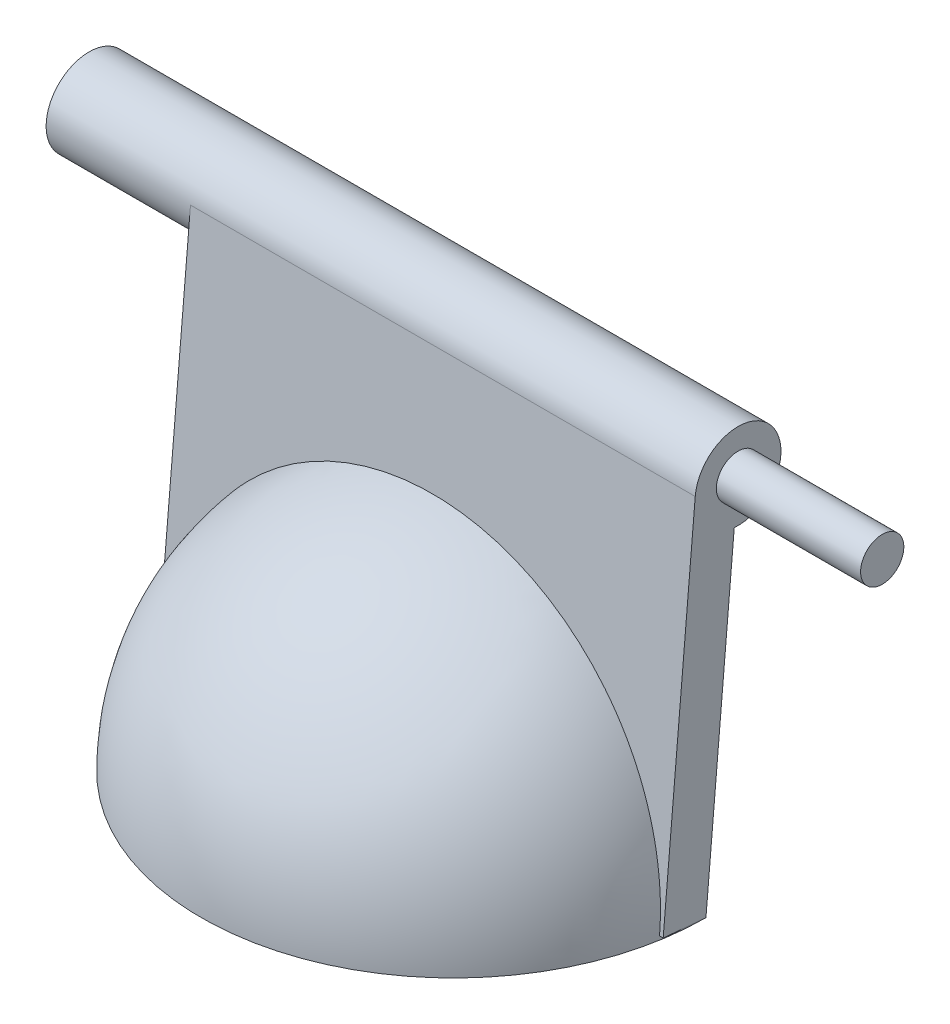
ISO-10303-21;
HEADER;
FILE_DESCRIPTION(('STEP AP214'),'2;1');
FILE_NAME('part.step','',(''),(''),'','','');
FILE_SCHEMA(('AUTOMOTIVE_DESIGN { 1 0 10303 214 1 1 1 1 }'));
ENDSEC;
DATA;
#1=APPLICATION_CONTEXT('core data for automotive mechanical design processes');
#2=APPLICATION_PROTOCOL_DEFINITION('international standard','automotive_design',2000,#1);
#3=PRODUCT_CONTEXT('',#1,'mechanical');
#4=PRODUCT('Part','Part','',(#3));
#5=PRODUCT_RELATED_PRODUCT_CATEGORY('part','',(#4));
#6=PRODUCT_DEFINITION_FORMATION('','',#4);
#7=PRODUCT_DEFINITION_CONTEXT('part definition',#1,'design');
#8=PRODUCT_DEFINITION('design','',#6,#7);
#9=PRODUCT_DEFINITION_SHAPE('','',#8);
#10=(LENGTH_UNIT() NAMED_UNIT(*) SI_UNIT(.MILLI.,.METRE.));
#11=(NAMED_UNIT(*) PLANE_ANGLE_UNIT() SI_UNIT($,.RADIAN.));
#12=(NAMED_UNIT(*) SI_UNIT($,.STERADIAN.) SOLID_ANGLE_UNIT());
#13=UNCERTAINTY_MEASURE_WITH_UNIT(LENGTH_MEASURE(1.E-05),#10,'distance_accuracy_value','');
#14=(GEOMETRIC_REPRESENTATION_CONTEXT(3) GLOBAL_UNCERTAINTY_ASSIGNED_CONTEXT((#13)) GLOBAL_UNIT_ASSIGNED_CONTEXT((#10,
#11,#12)) REPRESENTATION_CONTEXT('',''));
#15=CARTESIAN_POINT('',(0.,0.,0.));
#16=DIRECTION('',(0.,0.,1.));
#17=DIRECTION('',(1.,0.,0.));
#18=AXIS2_PLACEMENT_3D('',#15,#16,#17);
#19=CARTESIAN_POINT('',(45.,-25.4072411203425,2.22284556949957));
#20=DIRECTION('',(0.,0.996194698091746,-0.0871557427476543));
#21=DIRECTION('',(0.,0.0871557427476543,0.996194698091746));
#22=AXIS2_PLACEMENT_3D('',#19,#20,#21);
#23=PLANE('',#22);
#24=CARTESIAN_POINT('',(27.5,-25.4072411203425,2.22284556949956));
#25=DIRECTION('',(0.,0.996194698091746,-0.0871557427476543));
#26=DIRECTION('',(0.,0.0871557427476543,0.996194698091746));
#27=AXIS2_PLACEMENT_3D('',#24,#25,#26);
#28=CIRCLE('',#27,17.5);
#29=CARTESIAN_POINT('',(10.2551603733175,-25.1477348963113,5.18901528306774));
#30=VERTEX_POINT('',#29);
#31=CARTESIAN_POINT('',(10.,-25.4072411203425,2.22284556949957));
#32=VERTEX_POINT('',#31);
#33=EDGE_CURVE('E217',#30,#32,#28,.F.);
#34=ORIENTED_EDGE('',*,*,#33,.F.);
#35=DIRECTION('',(-1.,0.,0.));
#36=VECTOR('',#35,1.);
#37=CARTESIAN_POINT('',(45.,-25.1477348963113,5.18901528306774));
#38=LINE('',#37,#36);
#39=CARTESIAN_POINT('',(10.,-25.1477348963113,5.18901528306774));
#40=VERTEX_POINT('',#39);
#41=EDGE_CURVE('E185',#30,#40,#38,.T.);
#42=ORIENTED_EDGE('',*,*,#41,.T.);
#43=DIRECTION('',(0.,-0.0871557427476543,-0.996194698091746));
#44=VECTOR('',#43,1.);
#45=CARTESIAN_POINT('',(10.,-25.4072411203425,2.22284556949957));
#46=LINE('',#45,#44);
#47=EDGE_CURVE('E175',#40,#32,#46,.T.);
#48=ORIENTED_EDGE('',*,*,#47,.T.);
#49=EDGE_LOOP('',(#34,#42,#48));
#50=FACE_BOUND('',#49,.T.);
#51=ADVANCED_FACE('F47',(#50),#23,.F.);
#52=CARTESIAN_POINT('',(45.,-25.4072411203425,2.22284556949957));
#53=VERTEX_POINT('',#52);
#54=CARTESIAN_POINT('',(44.7448396266825,-25.1477348963113,5.18901528306774));
#55=VERTEX_POINT('',#54);
#56=EDGE_CURVE('E215',#53,#55,#28,.F.);
#57=ORIENTED_EDGE('',*,*,#56,.F.);
#58=DIRECTION('',(0.,-0.0871557427476543,-0.996194698091746));
#59=VECTOR('',#58,1.);
#60=CARTESIAN_POINT('',(45.,-25.4072411203425,2.22284556949957));
#61=LINE('',#60,#59);
#62=CARTESIAN_POINT('',(45.,-25.1477348963113,5.18901528306774));
#63=VERTEX_POINT('',#62);
#64=EDGE_CURVE('E163',#63,#53,#61,.T.);
#65=ORIENTED_EDGE('',*,*,#64,.F.);
#66=EDGE_CURVE('E186',#63,#55,#38,.T.);
#67=ORIENTED_EDGE('',*,*,#66,.T.);
#68=EDGE_LOOP('',(#57,#65,#67));
#69=FACE_BOUND('',#68,.T.);
#70=ADVANCED_FACE('F247',(#69),#23,.F.);
#71=CARTESIAN_POINT('',(55.,0.,0.));
#72=DIRECTION('',(-1.,0.,0.));
#73=DIRECTION('',(0.,0.,1.));
#74=AXIS2_PLACEMENT_3D('',#71,#72,#73);
#75=CYLINDRICAL_SURFACE('',#74,2.9775);
#76=CARTESIAN_POINT('',(0.,0.,0.));
#77=DIRECTION('',(1.,0.,0.));
#78=DIRECTION('',(0.,0.,-1.));
#79=AXIS2_PLACEMENT_3D('',#76,#77,#78);
#80=CIRCLE('',#79,2.9775);
#81=CARTESIAN_POINT('',(0.,0.,-2.9775));
#82=VERTEX_POINT('',#81);
#83=EDGE_CURVE('E207',#82,#82,#80,.T.);
#84=ORIENTED_EDGE('',*,*,#83,.T.);
#85=EDGE_LOOP('',(#84));
#86=FACE_BOUND('',#85,.T.);
#87=DIRECTION('',(-1.,0.,0.));
#88=VECTOR('',#87,1.);
#89=CARTESIAN_POINT('',(45.,0.25950622403113,2.96616971356818));
#90=LINE('',#89,#88);
#91=CARTESIAN_POINT('',(45.,0.25950622403113,2.96616971356818));
#92=VERTEX_POINT('',#91);
#93=CARTESIAN_POINT('',(10.,0.259506224031141,2.96616971356817));
#94=VERTEX_POINT('',#93);
#95=EDGE_CURVE('E71',#92,#94,#90,.T.);
#96=ORIENTED_EDGE('',*,*,#95,.F.);
#97=CARTESIAN_POINT('',(45.,0.,0.));
#98=DIRECTION('',(1.,0.,0.));
#99=DIRECTION('',(0.,0.,-1.));
#100=AXIS2_PLACEMENT_3D('',#97,#98,#99);
#101=CIRCLE('',#100,2.9775);
#102=CARTESIAN_POINT('',(45.,-2.96616971356817,0.259506224031141));
#103=VERTEX_POINT('',#102);
#104=EDGE_CURVE('E200',#103,#92,#101,.T.);
#105=ORIENTED_EDGE('',*,*,#104,.F.);
#106=DIRECTION('',(-1.,0.,0.));
#107=VECTOR('',#106,1.);
#108=CARTESIAN_POINT('',(55.,-2.96616971356817,0.259506224031141));
#109=LINE('',#108,#107);
#110=CARTESIAN_POINT('',(10.,-2.96616971356817,0.259506224031141));
#111=VERTEX_POINT('',#110);
#112=EDGE_CURVE('E192',#111,#103,#109,.F.);
#113=ORIENTED_EDGE('',*,*,#112,.F.);
#114=CARTESIAN_POINT('',(10.,0.,0.));
#115=DIRECTION('',(-1.,0.,0.));
#116=DIRECTION('',(0.,0.,1.));
#117=AXIS2_PLACEMENT_3D('',#114,#115,#116);
#118=CIRCLE('',#117,2.9775);
#119=EDGE_CURVE('E211',#111,#94,#118,.T.);
#120=ORIENTED_EDGE('',*,*,#119,.T.);
#121=EDGE_LOOP('',(#96,#105,#113,#120));
#122=FACE_BOUND('',#121,.T.);
#123=ADVANCED_FACE('F49',(#86,#122),#75,.T.);
#124=CARTESIAN_POINT('',(0.,0.,0.));
#125=DIRECTION('',(1.,0.,0.));
#126=DIRECTION('',(0.,0.,-1.));
#127=AXIS2_PLACEMENT_3D('',#124,#125,#126);
#128=PLANE('',#127);
#129=ORIENTED_EDGE('',*,*,#83,.F.);
#130=EDGE_LOOP('',(#129));
#131=FACE_BOUND('',#130,.T.);
#132=ADVANCED_FACE('F359',(#131),#128,.F.);
#133=CARTESIAN_POINT('',(45.,0.,0.));
#134=DIRECTION('',(1.,0.,0.));
#135=DIRECTION('',(0.,0.,-1.));
#136=AXIS2_PLACEMENT_3D('',#133,#134,#135);
#137=PLANE('',#136);
#138=CARTESIAN_POINT('',(45.,0.,0.));
#139=DIRECTION('',(1.,0.,0.));
#140=DIRECTION('',(0.,0.,-1.));
#141=AXIS2_PLACEMENT_3D('',#138,#139,#140);
#142=CIRCLE('',#141,1.5);
#143=CARTESIAN_POINT('',(45.,0.,-1.5));
#144=VERTEX_POINT('',#143);
#145=EDGE_CURVE('E196',#144,#144,#142,.T.);
#146=ORIENTED_EDGE('',*,*,#145,.F.);
#147=EDGE_LOOP('',(#146));
#148=FACE_BOUND('',#147,.T.);
#149=ORIENTED_EDGE('',*,*,#104,.T.);
#150=DIRECTION('',(0.,-0.996194698091746,0.0871557427476543));
#151=VECTOR('',#150,1.);
#152=CARTESIAN_POINT('',(45.,-25.1477348963113,5.18901528306774));
#153=LINE('',#152,#151);
#154=EDGE_CURVE('E160',#92,#63,#153,.T.);
#155=ORIENTED_EDGE('',*,*,#154,.T.);
#156=ORIENTED_EDGE('',*,*,#64,.T.);
#157=DIRECTION('',(0.,0.996194698091746,-0.0871557427476545));
#158=VECTOR('',#157,1.);
#159=CARTESIAN_POINT('',(45.,0.,0.));
#160=LINE('',#159,#158);
#161=EDGE_CURVE('E168',#53,#103,#160,.T.);
#162=ORIENTED_EDGE('',*,*,#161,.T.);
#163=EDGE_LOOP('',(#149,#155,#156,#162));
#164=FACE_BOUND('',#163,.T.);
#165=ADVANCED_FACE('F243',(#148,#164),#137,.T.);
#166=CARTESIAN_POINT('',(45.,0.,0.));
#167=DIRECTION('',(1.,0.,0.));
#168=DIRECTION('',(0.,0.,-1.));
#169=AXIS2_PLACEMENT_3D('',#166,#167,#168);
#170=CYLINDRICAL_SURFACE('',#169,1.5);
#171=ORIENTED_EDGE('',*,*,#145,.T.);
#172=EDGE_LOOP('',(#171));
#173=FACE_BOUND('',#172,.T.);
#174=CARTESIAN_POINT('',(55.,0.,0.));
#175=DIRECTION('',(1.,0.,0.));
#176=DIRECTION('',(0.,0.,-1.));
#177=AXIS2_PLACEMENT_3D('',#174,#175,#176);
#178=CIRCLE('',#177,1.5);
#179=CARTESIAN_POINT('',(55.,0.,-1.5));
#180=VERTEX_POINT('',#179);
#181=EDGE_CURVE('E195',#180,#180,#178,.T.);
#182=ORIENTED_EDGE('',*,*,#181,.F.);
#183=EDGE_LOOP('',(#182));
#184=FACE_BOUND('',#183,.T.);
#185=ADVANCED_FACE('F358',(#173,#184),#170,.T.);
#186=CARTESIAN_POINT('',(55.,0.,0.));
#187=DIRECTION('',(1.,0.,0.));
#188=DIRECTION('',(0.,0.,-1.));
#189=AXIS2_PLACEMENT_3D('',#186,#187,#188);
#190=PLANE('',#189);
#191=ORIENTED_EDGE('',*,*,#181,.T.);
#192=EDGE_LOOP('',(#191));
#193=FACE_BOUND('',#192,.T.);
#194=ADVANCED_FACE('F259',(#193),#190,.T.);
#195=CARTESIAN_POINT('',(45.,0.,0.));
#196=DIRECTION('',(0.,0.0871557427476545,0.996194698091746));
#197=DIRECTION('',(0.,-0.996194698091746,0.0871557427476545));
#198=AXIS2_PLACEMENT_3D('',#195,#196,#197);
#199=PLANE('',#198);
#200=DIRECTION('',(-1.,0.,0.));
#201=VECTOR('',#200,1.);
#202=CARTESIAN_POINT('',(45.,-25.4072411203425,2.22284556949957));
#203=LINE('',#202,#201);
#204=CARTESIAN_POINT('',(42.5,-25.4072411203425,2.22284556949957));
#205=VERTEX_POINT('',#204);
#206=EDGE_CURVE('E172',#53,#205,#203,.T.);
#207=ORIENTED_EDGE('',*,*,#206,.T.);
#208=CARTESIAN_POINT('',(27.5,-25.4072411203425,2.22284556949957));
#209=DIRECTION('',(0.,-0.0871557427476545,-0.996194698091746));
#210=DIRECTION('',(0.,0.996194698091746,-0.0871557427476545));
#211=AXIS2_PLACEMENT_3D('',#208,#209,#210);
#212=CIRCLE('',#211,15.);
#213=CARTESIAN_POINT('',(12.5,-25.4072411203425,2.22284556949957));
#214=VERTEX_POINT('',#213);
#215=EDGE_CURVE('E121',#214,#205,#212,.T.);
#216=ORIENTED_EDGE('',*,*,#215,.F.);
#217=DIRECTION('',(1.,0.,0.));
#218=VECTOR('',#217,1.);
#219=CARTESIAN_POINT('',(0.,-25.4072411203425,2.22284556949957));
#220=LINE('',#219,#218);
#221=EDGE_CURVE('E152',#32,#214,#220,.T.);
#222=ORIENTED_EDGE('',*,*,#221,.F.);
#223=DIRECTION('',(0.,0.996194698091746,-0.0871557427476545));
#224=VECTOR('',#223,1.);
#225=CARTESIAN_POINT('',(10.,0.,0.));
#226=LINE('',#225,#224);
#227=EDGE_CURVE('E164',#32,#111,#226,.T.);
#228=ORIENTED_EDGE('',*,*,#227,.T.);
#229=ORIENTED_EDGE('',*,*,#112,.T.);
#230=ORIENTED_EDGE('',*,*,#161,.F.);
#231=EDGE_LOOP('',(#207,#216,#222,#228,#229,#230));
#232=FACE_BOUND('',#231,.T.);
#233=ADVANCED_FACE('F233',(#232),#199,.F.);
#234=CARTESIAN_POINT('',(45.,-25.1477348963113,5.18901528306774));
#235=DIRECTION('',(0.,-0.0871557427476543,-0.996194698091746));
#236=DIRECTION('',(0.,0.996194698091746,-0.0871557427476543));
#237=AXIS2_PLACEMENT_3D('',#234,#235,#236);
#238=PLANE('',#237);
#239=CARTESIAN_POINT('',(27.5,-25.1477348963113,5.18901528306774));
#240=DIRECTION('',(0.,-0.0871557427476543,-0.996194698091746));
#241=DIRECTION('',(0.,0.996194698091746,-0.0871557427476543));
#242=AXIS2_PLACEMENT_3D('',#239,#240,#241);
#243=CIRCLE('',#242,17.2448396266825);
#244=EDGE_CURVE('E156',#55,#30,#243,.F.);
#245=ORIENTED_EDGE('',*,*,#244,.F.);
#246=ORIENTED_EDGE('',*,*,#66,.F.);
#247=ORIENTED_EDGE('',*,*,#154,.F.);
#248=ORIENTED_EDGE('',*,*,#95,.T.);
#249=DIRECTION('',(0.,-0.996194698091746,0.0871557427476543));
#250=VECTOR('',#249,1.);
#251=CARTESIAN_POINT('',(10.,-25.1477348963113,5.18901528306774));
#252=LINE('',#251,#250);
#253=EDGE_CURVE('E159',#94,#40,#252,.T.);
#254=ORIENTED_EDGE('',*,*,#253,.T.);
#255=ORIENTED_EDGE('',*,*,#41,.F.);
#256=EDGE_LOOP('',(#245,#246,#247,#248,#254,#255));
#257=FACE_BOUND('',#256,.T.);
#258=ADVANCED_FACE('F248',(#257),#238,.F.);
#259=CARTESIAN_POINT('',(10.,0.,0.));
#260=DIRECTION('',(-1.,0.,0.));
#261=DIRECTION('',(0.,0.,1.));
#262=AXIS2_PLACEMENT_3D('',#259,#260,#261);
#263=PLANE('',#262);
#264=ORIENTED_EDGE('',*,*,#119,.F.);
#265=ORIENTED_EDGE('',*,*,#227,.F.);
#266=ORIENTED_EDGE('',*,*,#47,.F.);
#267=ORIENTED_EDGE('',*,*,#253,.F.);
#268=EDGE_LOOP('',(#264,#265,#266,#267));
#269=FACE_BOUND('',#268,.T.);
#270=ADVANCED_FACE('F238',(#269),#263,.T.);
#271=CARTESIAN_POINT('',(27.5,-25.4072411203425,2.22284556949956));
#272=DIRECTION('',(-1.,0.,0.));
#273=DIRECTION('',(0.,0.,1.));
#274=AXIS2_PLACEMENT_3D('',#271,#272,#273);
#275=SPHERICAL_SURFACE('',#274,15.);
#276=CARTESIAN_POINT('',(27.5,-25.1457738920995,5.21142966377479));
#277=DIRECTION('',(0.,-0.0871557427476545,-0.996194698091746));
#278=DIRECTION('',(0.,0.996194698091746,-0.0871557427476545));
#279=AXIS2_PLACEMENT_3D('',#276,#277,#278);
#280=CIRCLE('',#279,14.6969384566991);
#281=CARTESIAN_POINT('',(12.8030615433009,-25.1457738920995,5.21142966377479));
#282=VERTEX_POINT('',#281);
#283=CARTESIAN_POINT('',(42.1969384566991,-25.1457738920995,5.21142966377479));
#284=VERTEX_POINT('',#283);
#285=EDGE_CURVE('E11',#282,#284,#280,.T.);
#286=ORIENTED_EDGE('',*,*,#285,.T.);
#287=CARTESIAN_POINT('',(27.5,-25.4072411203425,2.22284556949956));
#288=DIRECTION('',(0.,0.996194698091746,-0.0871557427476543));
#289=DIRECTION('',(0.,0.0871557427476543,0.996194698091746));
#290=AXIS2_PLACEMENT_3D('',#287,#288,#289);
#291=CIRCLE('',#290,15.);
#292=EDGE_CURVE('E63',#205,#284,#291,.F.);
#293=ORIENTED_EDGE('',*,*,#292,.F.);
#294=CARTESIAN_POINT('',(27.5,-25.4072411203425,2.22284556949956));
#295=DIRECTION('',(0.,-1.,0.));
#296=DIRECTION('',(0.,0.,-1.));
#297=AXIS2_PLACEMENT_3D('',#294,#295,#296);
#298=CIRCLE('',#297,15.);
#299=EDGE_CURVE('E143',#205,#214,#298,.T.);
#300=ORIENTED_EDGE('',*,*,#299,.T.);
#301=EDGE_CURVE('E56',#282,#214,#291,.F.);
#302=ORIENTED_EDGE('',*,*,#301,.F.);
#303=EDGE_LOOP('',(#286,#293,#300,#302));
#304=FACE_BOUND('',#303,.T.);
#305=ADVANCED_FACE('F256',(#304),#275,.F.);
#306=CARTESIAN_POINT('',(27.5,-25.4072411203425,2.22284556949956));
#307=DIRECTION('',(-1.,0.,0.));
#308=DIRECTION('',(0.,0.,1.));
#309=AXIS2_PLACEMENT_3D('',#306,#307,#308);
#310=SPHERICAL_SURFACE('',#309,17.5);
#311=ORIENTED_EDGE('',*,*,#244,.T.);
#312=ORIENTED_EDGE('',*,*,#33,.T.);
#313=CARTESIAN_POINT('',(27.5,-25.4072411203425,2.22284556949956));
#314=DIRECTION('',(0.,-1.,0.));
#315=DIRECTION('',(0.,0.,-1.));
#316=AXIS2_PLACEMENT_3D('',#313,#314,#315);
#317=CIRCLE('',#316,17.5);
#318=EDGE_CURVE('E148',#53,#32,#317,.T.);
#319=ORIENTED_EDGE('',*,*,#318,.F.);
#320=ORIENTED_EDGE('',*,*,#56,.T.);
#321=EDGE_LOOP('',(#311,#312,#319,#320));
#322=FACE_BOUND('',#321,.T.);
#323=ADVANCED_FACE('F224',(#322),#310,.T.);
#324=CARTESIAN_POINT('',(0.,-25.4072411203425,2.22284556949957));
#325=DIRECTION('',(0.,-1.,0.));
#326=DIRECTION('',(0.,0.,-1.));
#327=AXIS2_PLACEMENT_3D('',#324,#325,#326);
#328=PLANE('',#327);
#329=ORIENTED_EDGE('',*,*,#299,.F.);
#330=ORIENTED_EDGE('',*,*,#206,.F.);
#331=ORIENTED_EDGE('',*,*,#318,.T.);
#332=ORIENTED_EDGE('',*,*,#221,.T.);
#333=EDGE_LOOP('',(#329,#330,#331,#332));
#334=FACE_BOUND('',#333,.T.);
#335=ADVANCED_FACE('F231',(#334),#328,.T.);
#336=CARTESIAN_POINT('',(12.5,-25.1457738920995,5.21142966377479));
#337=DIRECTION('',(0.,-0.996194698091746,0.0871557427476545));
#338=DIRECTION('',(0.,-0.0871557427476545,-0.996194698091746));
#339=AXIS2_PLACEMENT_3D('',#336,#337,#338);
#340=PLANE('',#339);
#341=ORIENTED_EDGE('',*,*,#292,.T.);
#342=DIRECTION('',(-1.,0.,0.));
#343=VECTOR('',#342,1.);
#344=CARTESIAN_POINT('',(12.5,-25.1457738920995,5.21142966377479));
#345=LINE('',#344,#343);
#346=CARTESIAN_POINT('',(42.5,-25.1457738920995,5.21142966377479));
#347=VERTEX_POINT('',#346);
#348=EDGE_CURVE('E125',#347,#284,#345,.T.);
#349=ORIENTED_EDGE('',*,*,#348,.F.);
#350=DIRECTION('',(0.,-0.0871557427476545,-0.996194698091746));
#351=VECTOR('',#350,1.);
#352=CARTESIAN_POINT('',(42.5,-25.1457738920995,5.21142966377479));
#353=LINE('',#352,#351);
#354=EDGE_CURVE('E115',#347,#205,#353,.T.);
#355=ORIENTED_EDGE('',*,*,#354,.T.);
#356=EDGE_LOOP('',(#341,#349,#355));
#357=FACE_BOUND('',#356,.T.);
#358=ADVANCED_FACE('F135',(#357),#340,.F.);
#359=CARTESIAN_POINT('',(27.5,-25.1457738920995,5.21142966377479));
#360=DIRECTION('',(0.,-0.0871557427476545,-0.996194698091746));
#361=DIRECTION('',(0.,0.996194698091746,-0.0871557427476545));
#362=AXIS2_PLACEMENT_3D('',#359,#360,#361);
#363=CYLINDRICAL_SURFACE('',#362,15.);
#364=ORIENTED_EDGE('',*,*,#215,.T.);
#365=ORIENTED_EDGE('',*,*,#354,.F.);
#366=CARTESIAN_POINT('',(27.5,-25.1457738920995,5.21142966377479));
#367=DIRECTION('',(0.,-0.0871557427476545,-0.996194698091746));
#368=DIRECTION('',(0.,0.996194698091746,-0.0871557427476545));
#369=AXIS2_PLACEMENT_3D('',#366,#367,#368);
#370=CIRCLE('',#369,15.);
#371=CARTESIAN_POINT('',(12.5,-25.1457738920995,5.21142966377479));
#372=VERTEX_POINT('',#371);
#373=EDGE_CURVE('E119',#372,#347,#370,.T.);
#374=ORIENTED_EDGE('',*,*,#373,.F.);
#375=DIRECTION('',(0.,-0.0871557427476545,-0.996194698091746));
#376=VECTOR('',#375,1.);
#377=CARTESIAN_POINT('',(12.5,-25.1457738920995,5.21142966377479));
#378=LINE('',#377,#376);
#379=EDGE_CURVE('E124',#372,#214,#378,.T.);
#380=ORIENTED_EDGE('',*,*,#379,.T.);
#381=EDGE_LOOP('',(#364,#365,#374,#380));
#382=FACE_BOUND('',#381,.T.);
#383=ADVANCED_FACE('F117',(#382),#363,.F.);
#384=EDGE_CURVE('E131',#282,#372,#345,.T.);
#385=ORIENTED_EDGE('',*,*,#384,.F.);
#386=ORIENTED_EDGE('',*,*,#301,.T.);
#387=ORIENTED_EDGE('',*,*,#379,.F.);
#388=EDGE_LOOP('',(#385,#386,#387));
#389=FACE_BOUND('',#388,.T.);
#390=ADVANCED_FACE('F278',(#389),#340,.F.);
#391=CARTESIAN_POINT('',(27.5,-25.1457738920995,5.21142966377479));
#392=DIRECTION('',(0.,-0.0871557427476545,-0.996194698091746));
#393=DIRECTION('',(0.,0.996194698091746,-0.0871557427476545));
#394=AXIS2_PLACEMENT_3D('',#391,#392,#393);
#395=PLANE('',#394);
#396=ORIENTED_EDGE('',*,*,#384,.T.);
#397=ORIENTED_EDGE('',*,*,#373,.T.);
#398=ORIENTED_EDGE('',*,*,#348,.T.);
#399=ORIENTED_EDGE('',*,*,#285,.F.);
#400=EDGE_LOOP('',(#396,#397,#398,#399));
#401=FACE_BOUND('',#400,.T.);
#402=ADVANCED_FACE('F128',(#401),#395,.T.);
#403=CLOSED_SHELL('',(#51,#70,#123,#132,#165,#185,#194,#233,#258,#270,#305,#323,#335,#358,#383,
#390,#402));
#404=MANIFOLD_SOLID_BREP('B2',#403);
#405=ADVANCED_BREP_SHAPE_REPRESENTATION('',(#18,#404),#14);
#406=SHAPE_DEFINITION_REPRESENTATION(#9,#405);
ENDSEC;
END-ISO-10303-21;
